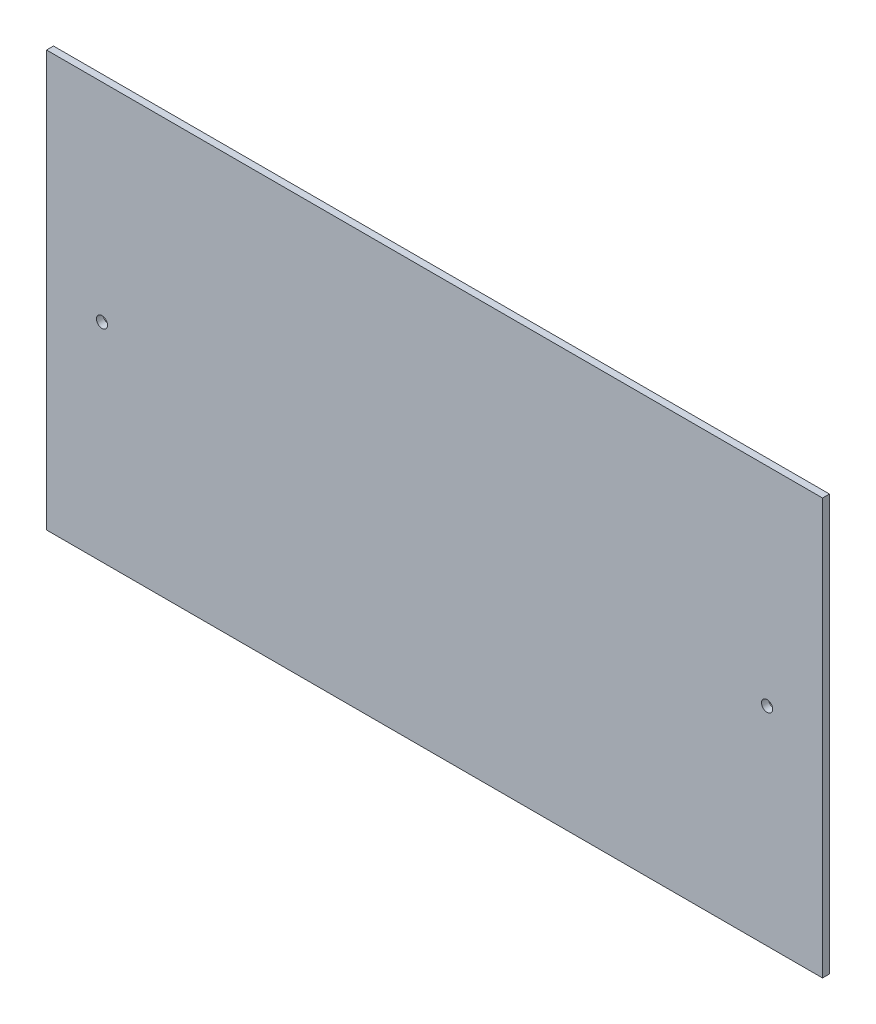
ISO-10303-21;
HEADER;
FILE_DESCRIPTION(('STEP AP214'),'2;1');
FILE_NAME('part.step','',(''),(''),'','','');
FILE_SCHEMA(('AUTOMOTIVE_DESIGN { 1 0 10303 214 1 1 1 1 }'));
ENDSEC;
DATA;
#1=APPLICATION_CONTEXT('core data for automotive mechanical design processes');
#2=APPLICATION_PROTOCOL_DEFINITION('international standard','automotive_design',2000,#1);
#3=PRODUCT_CONTEXT('',#1,'mechanical');
#4=PRODUCT('Part','Part','',(#3));
#5=PRODUCT_RELATED_PRODUCT_CATEGORY('part','',(#4));
#6=PRODUCT_DEFINITION_FORMATION('','',#4);
#7=PRODUCT_DEFINITION_CONTEXT('part definition',#1,'design');
#8=PRODUCT_DEFINITION('design','',#6,#7);
#9=PRODUCT_DEFINITION_SHAPE('','',#8);
#10=(LENGTH_UNIT() NAMED_UNIT(*) SI_UNIT(.MILLI.,.METRE.));
#11=(NAMED_UNIT(*) PLANE_ANGLE_UNIT() SI_UNIT($,.RADIAN.));
#12=(NAMED_UNIT(*) SI_UNIT($,.STERADIAN.) SOLID_ANGLE_UNIT());
#13=UNCERTAINTY_MEASURE_WITH_UNIT(LENGTH_MEASURE(1.E-05),#10,'distance_accuracy_value','');
#14=(GEOMETRIC_REPRESENTATION_CONTEXT(3) GLOBAL_UNCERTAINTY_ASSIGNED_CONTEXT((#13)) GLOBAL_UNIT_ASSIGNED_CONTEXT((#10,
#11,#12)) REPRESENTATION_CONTEXT('',''));
#15=CARTESIAN_POINT('',(0.,0.,0.));
#16=DIRECTION('',(0.,0.,1.));
#17=DIRECTION('',(1.,0.,0.));
#18=AXIS2_PLACEMENT_3D('',#15,#16,#17);
#19=CARTESIAN_POINT('',(0.,0.,2.5));
#20=DIRECTION('',(1.,0.,0.));
#21=DIRECTION('',(0.,0.,-1.));
#22=AXIS2_PLACEMENT_3D('',#19,#20,#21);
#23=PLANE('',#22);
#24=DIRECTION('',(0.,-1.,0.));
#25=VECTOR('',#24,1.);
#26=CARTESIAN_POINT('',(0.,0.,0.));
#27=LINE('',#26,#25);
#28=CARTESIAN_POINT('',(0.,150.,0.));
#29=VERTEX_POINT('',#28);
#30=CARTESIAN_POINT('',(0.,0.,0.));
#31=VERTEX_POINT('',#30);
#32=EDGE_CURVE('E103',#29,#31,#27,.T.);
#33=ORIENTED_EDGE('',*,*,#32,.T.);
#34=DIRECTION('',(0.,0.,-1.));
#35=VECTOR('',#34,1.);
#36=CARTESIAN_POINT('',(0.,0.,2.5));
#37=LINE('',#36,#35);
#38=CARTESIAN_POINT('',(0.,0.,2.5));
#39=VERTEX_POINT('',#38);
#40=EDGE_CURVE('E11',#39,#31,#37,.T.);
#41=ORIENTED_EDGE('',*,*,#40,.F.);
#42=DIRECTION('',(0.,-1.,0.));
#43=VECTOR('',#42,1.);
#44=CARTESIAN_POINT('',(0.,0.,2.5));
#45=LINE('',#44,#43);
#46=CARTESIAN_POINT('',(0.,150.,2.5));
#47=VERTEX_POINT('',#46);
#48=EDGE_CURVE('E90',#47,#39,#45,.T.);
#49=ORIENTED_EDGE('',*,*,#48,.F.);
#50=DIRECTION('',(0.,0.,-1.));
#51=VECTOR('',#50,1.);
#52=CARTESIAN_POINT('',(0.,150.,2.5));
#53=LINE('',#52,#51);
#54=EDGE_CURVE('E99',#47,#29,#53,.T.);
#55=ORIENTED_EDGE('',*,*,#54,.T.);
#56=EDGE_LOOP('',(#33,#41,#49,#55));
#57=FACE_BOUND('',#56,.T.);
#58=ADVANCED_FACE('F37',(#57),#23,.F.);
#59=CARTESIAN_POINT('',(0.,0.,2.5));
#60=DIRECTION('',(0.,1.,0.));
#61=DIRECTION('',(0.,0.,1.));
#62=AXIS2_PLACEMENT_3D('',#59,#60,#61);
#63=PLANE('',#62);
#64=DIRECTION('',(1.,0.,0.));
#65=VECTOR('',#64,1.);
#66=CARTESIAN_POINT('',(0.,0.,0.));
#67=LINE('',#66,#65);
#68=CARTESIAN_POINT('',(280.,0.,0.));
#69=VERTEX_POINT('',#68);
#70=EDGE_CURVE('E94',#31,#69,#67,.T.);
#71=ORIENTED_EDGE('',*,*,#70,.T.);
#72=DIRECTION('',(0.,0.,-1.));
#73=VECTOR('',#72,1.);
#74=CARTESIAN_POINT('',(280.,0.,2.5));
#75=LINE('',#74,#73);
#76=CARTESIAN_POINT('',(280.,0.,2.5));
#77=VERTEX_POINT('',#76);
#78=EDGE_CURVE('E46',#77,#69,#75,.T.);
#79=ORIENTED_EDGE('',*,*,#78,.F.);
#80=DIRECTION('',(1.,0.,0.));
#81=VECTOR('',#80,1.);
#82=CARTESIAN_POINT('',(0.,0.,2.5));
#83=LINE('',#82,#81);
#84=EDGE_CURVE('E85',#39,#77,#83,.T.);
#85=ORIENTED_EDGE('',*,*,#84,.F.);
#86=ORIENTED_EDGE('',*,*,#40,.T.);
#87=EDGE_LOOP('',(#71,#79,#85,#86));
#88=FACE_BOUND('',#87,.T.);
#89=ADVANCED_FACE('F93',(#88),#63,.F.);
#90=CARTESIAN_POINT('',(280.,0.,2.5));
#91=DIRECTION('',(-1.,0.,0.));
#92=DIRECTION('',(0.,0.,1.));
#93=AXIS2_PLACEMENT_3D('',#90,#91,#92);
#94=PLANE('',#93);
#95=DIRECTION('',(0.,1.,0.));
#96=VECTOR('',#95,1.);
#97=CARTESIAN_POINT('',(280.,0.,0.));
#98=LINE('',#97,#96);
#99=CARTESIAN_POINT('',(280.,150.,0.));
#100=VERTEX_POINT('',#99);
#101=EDGE_CURVE('E72',#69,#100,#98,.T.);
#102=ORIENTED_EDGE('',*,*,#101,.T.);
#103=DIRECTION('',(0.,0.,-1.));
#104=VECTOR('',#103,1.);
#105=CARTESIAN_POINT('',(280.,150.,2.5));
#106=LINE('',#105,#104);
#107=CARTESIAN_POINT('',(280.,150.,2.5));
#108=VERTEX_POINT('',#107);
#109=EDGE_CURVE('E95',#108,#100,#106,.T.);
#110=ORIENTED_EDGE('',*,*,#109,.F.);
#111=DIRECTION('',(0.,1.,0.));
#112=VECTOR('',#111,1.);
#113=CARTESIAN_POINT('',(280.,0.,2.5));
#114=LINE('',#113,#112);
#115=EDGE_CURVE('E88',#77,#108,#114,.T.);
#116=ORIENTED_EDGE('',*,*,#115,.F.);
#117=ORIENTED_EDGE('',*,*,#78,.T.);
#118=EDGE_LOOP('',(#102,#110,#116,#117));
#119=FACE_BOUND('',#118,.T.);
#120=ADVANCED_FACE('F97',(#119),#94,.F.);
#121=CARTESIAN_POINT('',(0.,150.,2.5));
#122=DIRECTION('',(0.,-1.,0.));
#123=DIRECTION('',(0.,0.,-1.));
#124=AXIS2_PLACEMENT_3D('',#121,#122,#123);
#125=PLANE('',#124);
#126=DIRECTION('',(-1.,0.,0.));
#127=VECTOR('',#126,1.);
#128=CARTESIAN_POINT('',(0.,150.,0.));
#129=LINE('',#128,#127);
#130=EDGE_CURVE('E78',#100,#29,#129,.T.);
#131=ORIENTED_EDGE('',*,*,#130,.T.);
#132=ORIENTED_EDGE('',*,*,#54,.F.);
#133=DIRECTION('',(-1.,0.,0.));
#134=VECTOR('',#133,1.);
#135=CARTESIAN_POINT('',(0.,150.,2.5));
#136=LINE('',#135,#134);
#137=EDGE_CURVE('E55',#108,#47,#136,.T.);
#138=ORIENTED_EDGE('',*,*,#137,.F.);
#139=ORIENTED_EDGE('',*,*,#109,.T.);
#140=EDGE_LOOP('',(#131,#132,#138,#139));
#141=FACE_BOUND('',#140,.T.);
#142=ADVANCED_FACE('F129',(#141),#125,.F.);
#143=CARTESIAN_POINT('',(0.,0.,2.5));
#144=DIRECTION('',(0.,0.,-1.));
#145=DIRECTION('',(-1.,0.,0.));
#146=AXIS2_PLACEMENT_3D('',#143,#144,#145);
#147=PLANE('',#146);
#148=CARTESIAN_POINT('',(260.,75.,2.5));
#149=DIRECTION('',(0.,0.,1.));
#150=DIRECTION('',(1.,0.,0.));
#151=AXIS2_PLACEMENT_3D('',#148,#149,#150);
#152=CIRCLE('',#151,2.);
#153=CARTESIAN_POINT('',(262.,75.,2.5));
#154=VERTEX_POINT('',#153);
#155=EDGE_CURVE('E112',#154,#154,#152,.T.);
#156=ORIENTED_EDGE('',*,*,#155,.F.);
#157=EDGE_LOOP('',(#156));
#158=FACE_BOUND('',#157,.T.);
#159=CARTESIAN_POINT('',(20.,75.,2.5));
#160=DIRECTION('',(0.,0.,1.));
#161=DIRECTION('',(1.,0.,0.));
#162=AXIS2_PLACEMENT_3D('',#159,#160,#161);
#163=CIRCLE('',#162,2.);
#164=CARTESIAN_POINT('',(22.,75.,2.5));
#165=VERTEX_POINT('',#164);
#166=EDGE_CURVE('E117',#165,#165,#163,.T.);
#167=ORIENTED_EDGE('',*,*,#166,.F.);
#168=EDGE_LOOP('',(#167));
#169=FACE_BOUND('',#168,.T.);
#170=ORIENTED_EDGE('',*,*,#48,.T.);
#171=ORIENTED_EDGE('',*,*,#84,.T.);
#172=ORIENTED_EDGE('',*,*,#115,.T.);
#173=ORIENTED_EDGE('',*,*,#137,.T.);
#174=EDGE_LOOP('',(#170,#171,#172,#173));
#175=FACE_BOUND('',#174,.T.);
#176=ADVANCED_FACE('F86',(#158,#169,#175),#147,.F.);
#177=CARTESIAN_POINT('',(0.,0.,0.));
#178=DIRECTION('',(0.,0.,-1.));
#179=DIRECTION('',(-1.,0.,0.));
#180=AXIS2_PLACEMENT_3D('',#177,#178,#179);
#181=PLANE('',#180);
#182=CARTESIAN_POINT('',(260.,75.,0.));
#183=DIRECTION('',(0.,0.,-1.));
#184=DIRECTION('',(-1.,0.,0.));
#185=AXIS2_PLACEMENT_3D('',#182,#183,#184);
#186=CIRCLE('',#185,2.);
#187=CARTESIAN_POINT('',(258.,75.,0.));
#188=VERTEX_POINT('',#187);
#189=EDGE_CURVE('E40',#188,#188,#186,.T.);
#190=ORIENTED_EDGE('',*,*,#189,.F.);
#191=EDGE_LOOP('',(#190));
#192=FACE_BOUND('',#191,.T.);
#193=CARTESIAN_POINT('',(20.,75.,0.));
#194=DIRECTION('',(0.,0.,-1.));
#195=DIRECTION('',(-1.,0.,0.));
#196=AXIS2_PLACEMENT_3D('',#193,#194,#195);
#197=CIRCLE('',#196,2.);
#198=CARTESIAN_POINT('',(18.,75.,0.));
#199=VERTEX_POINT('',#198);
#200=EDGE_CURVE('E110',#199,#199,#197,.T.);
#201=ORIENTED_EDGE('',*,*,#200,.F.);
#202=EDGE_LOOP('',(#201));
#203=FACE_BOUND('',#202,.T.);
#204=ORIENTED_EDGE('',*,*,#32,.F.);
#205=ORIENTED_EDGE('',*,*,#130,.F.);
#206=ORIENTED_EDGE('',*,*,#101,.F.);
#207=ORIENTED_EDGE('',*,*,#70,.F.);
#208=EDGE_LOOP('',(#204,#205,#206,#207));
#209=FACE_BOUND('',#208,.T.);
#210=ADVANCED_FACE('F128',(#192,#203,#209),#181,.T.);
#211=CARTESIAN_POINT('',(20.,75.,-7.5));
#212=DIRECTION('',(0.,0.,1.));
#213=DIRECTION('',(1.,0.,0.));
#214=AXIS2_PLACEMENT_3D('',#211,#212,#213);
#215=CYLINDRICAL_SURFACE('',#214,2.);
#216=ORIENTED_EDGE('',*,*,#200,.T.);
#217=EDGE_LOOP('',(#216));
#218=FACE_BOUND('',#217,.T.);
#219=ORIENTED_EDGE('',*,*,#166,.T.);
#220=EDGE_LOOP('',(#219));
#221=FACE_BOUND('',#220,.T.);
#222=ADVANCED_FACE('F125',(#218,#221),#215,.F.);
#223=CARTESIAN_POINT('',(260.,75.,-7.5));
#224=DIRECTION('',(0.,0.,1.));
#225=DIRECTION('',(1.,0.,0.));
#226=AXIS2_PLACEMENT_3D('',#223,#224,#225);
#227=CYLINDRICAL_SURFACE('',#226,2.);
#228=ORIENTED_EDGE('',*,*,#189,.T.);
#229=EDGE_LOOP('',(#228));
#230=FACE_BOUND('',#229,.T.);
#231=ORIENTED_EDGE('',*,*,#155,.T.);
#232=EDGE_LOOP('',(#231));
#233=FACE_BOUND('',#232,.T.);
#234=ADVANCED_FACE('F179',(#230,#233),#227,.F.);
#235=CLOSED_SHELL('',(#58,#89,#120,#142,#176,#210,#222,#234));
#236=MANIFOLD_SOLID_BREP('B2',#235);
#237=ADVANCED_BREP_SHAPE_REPRESENTATION('',(#18,#236),#14);
#238=SHAPE_DEFINITION_REPRESENTATION(#9,#237);
ENDSEC;
END-ISO-10303-21;
